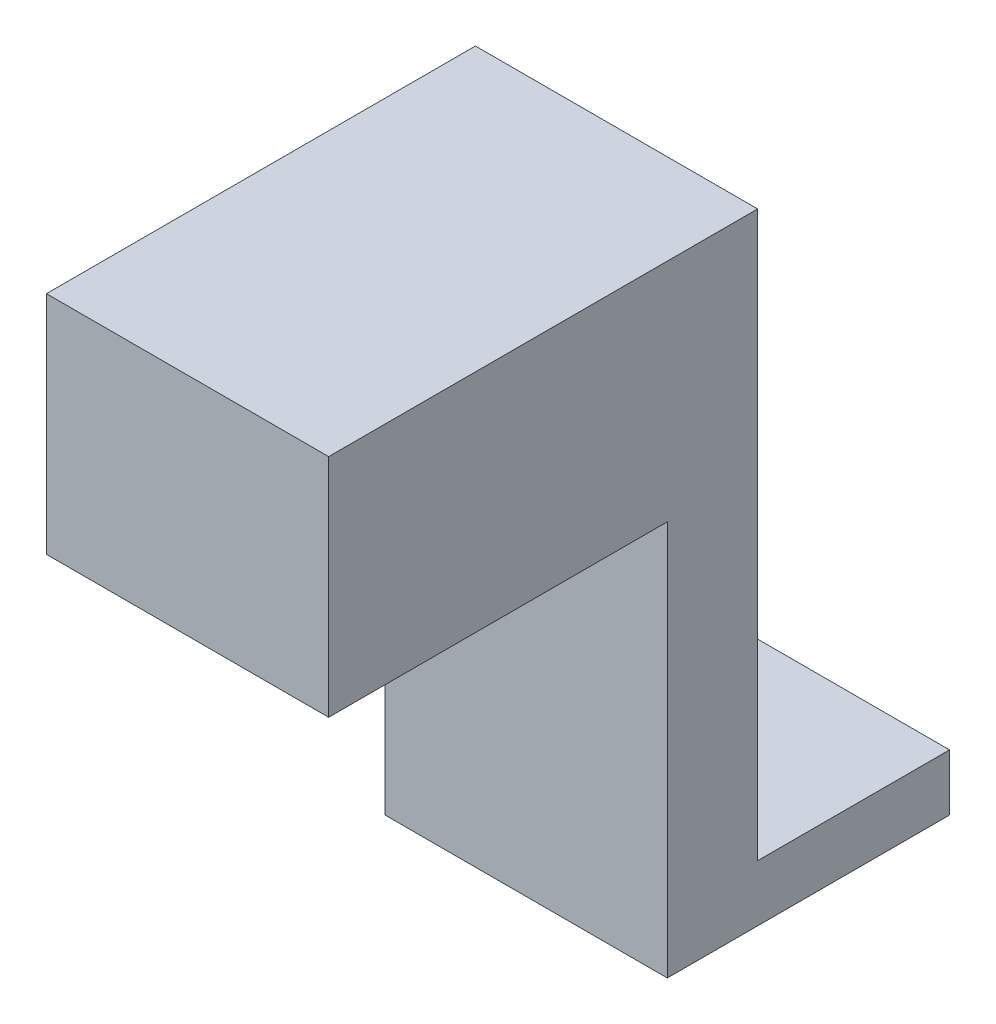
ISO-10303-21;
HEADER;
FILE_DESCRIPTION(('STEP AP214'),'2;1');
FILE_NAME('part.step','',(''),(''),'','','');
FILE_SCHEMA(('AUTOMOTIVE_DESIGN { 1 0 10303 214 1 1 1 1 }'));
ENDSEC;
DATA;
#1=APPLICATION_CONTEXT('core data for automotive mechanical design processes');
#2=APPLICATION_PROTOCOL_DEFINITION('international standard','automotive_design',2000,#1);
#3=PRODUCT_CONTEXT('',#1,'mechanical');
#4=PRODUCT('Part','Part','',(#3));
#5=PRODUCT_RELATED_PRODUCT_CATEGORY('part','',(#4));
#6=PRODUCT_DEFINITION_FORMATION('','',#4);
#7=PRODUCT_DEFINITION_CONTEXT('part definition',#1,'design');
#8=PRODUCT_DEFINITION('design','',#6,#7);
#9=PRODUCT_DEFINITION_SHAPE('','',#8);
#10=(LENGTH_UNIT() NAMED_UNIT(*) SI_UNIT(.MILLI.,.METRE.));
#11=(NAMED_UNIT(*) PLANE_ANGLE_UNIT() SI_UNIT($,.RADIAN.));
#12=(NAMED_UNIT(*) SI_UNIT($,.STERADIAN.) SOLID_ANGLE_UNIT());
#13=UNCERTAINTY_MEASURE_WITH_UNIT(LENGTH_MEASURE(1.E-05),#10,'distance_accuracy_value','');
#14=(GEOMETRIC_REPRESENTATION_CONTEXT(3) GLOBAL_UNCERTAINTY_ASSIGNED_CONTEXT((#13)) GLOBAL_UNIT_ASSIGNED_CONTEXT((#10,
#11,#12)) REPRESENTATION_CONTEXT('',''));
#15=CARTESIAN_POINT('',(0.,0.,0.));
#16=DIRECTION('',(0.,0.,1.));
#17=DIRECTION('',(1.,0.,0.));
#18=AXIS2_PLACEMENT_3D('',#15,#16,#17);
#19=CARTESIAN_POINT('',(12.5,5.,12.5));
#20=DIRECTION('',(0.,0.,-1.));
#21=DIRECTION('',(-1.,0.,0.));
#22=AXIS2_PLACEMENT_3D('',#19,#20,#21);
#23=PLANE('',#22);
#24=DIRECTION('',(1.,0.,0.));
#25=VECTOR('',#24,1.);
#26=CARTESIAN_POINT('',(-12.5,35.,12.5));
#27=LINE('',#26,#25);
#28=CARTESIAN_POINT('',(-12.5,35.,12.5));
#29=VERTEX_POINT('',#28);
#30=CARTESIAN_POINT('',(12.5,35.,12.5));
#31=VERTEX_POINT('',#30);
#32=EDGE_CURVE('E57',#29,#31,#27,.T.);
#33=ORIENTED_EDGE('',*,*,#32,.F.);
#34=DIRECTION('',(0.,-1.,0.));
#35=VECTOR('',#34,1.);
#36=CARTESIAN_POINT('',(-12.5,5.,12.5));
#37=LINE('',#36,#35);
#38=CARTESIAN_POINT('',(-12.5,0.,12.5));
#39=VERTEX_POINT('',#38);
#40=EDGE_CURVE('E11',#29,#39,#37,.T.);
#41=ORIENTED_EDGE('',*,*,#40,.T.);
#42=DIRECTION('',(1.,0.,0.));
#43=VECTOR('',#42,1.);
#44=CARTESIAN_POINT('',(12.5,0.,12.5));
#45=LINE('',#44,#43);
#46=CARTESIAN_POINT('',(12.5,0.,12.5));
#47=VERTEX_POINT('',#46);
#48=EDGE_CURVE('E156',#39,#47,#45,.T.);
#49=ORIENTED_EDGE('',*,*,#48,.T.);
#50=DIRECTION('',(0.,-1.,0.));
#51=VECTOR('',#50,1.);
#52=CARTESIAN_POINT('',(12.5,5.,12.5));
#53=LINE('',#52,#51);
#54=EDGE_CURVE('E51',#31,#47,#53,.T.);
#55=ORIENTED_EDGE('',*,*,#54,.F.);
#56=EDGE_LOOP('',(#33,#41,#49,#55));
#57=FACE_BOUND('',#56,.T.);
#58=ADVANCED_FACE('F43',(#57),#23,.F.);
#59=CARTESIAN_POINT('',(-12.5,5.,12.5));
#60=DIRECTION('',(1.,0.,0.));
#61=DIRECTION('',(0.,0.,-1.));
#62=AXIS2_PLACEMENT_3D('',#59,#60,#61);
#63=PLANE('',#62);
#64=DIRECTION('',(0.,0.,1.));
#65=VECTOR('',#64,1.);
#66=CARTESIAN_POINT('',(-12.5,0.,12.5));
#67=LINE('',#66,#65);
#68=CARTESIAN_POINT('',(-12.5,0.,-12.5));
#69=VERTEX_POINT('',#68);
#70=EDGE_CURVE('E146',#69,#39,#67,.T.);
#71=ORIENTED_EDGE('',*,*,#70,.T.);
#72=ORIENTED_EDGE('',*,*,#40,.F.);
#73=DIRECTION('',(0.,0.,-1.));
#74=VECTOR('',#73,1.);
#75=CARTESIAN_POINT('',(-12.5,35.,42.5));
#76=LINE('',#75,#74);
#77=CARTESIAN_POINT('',(-12.5,35.,42.5));
#78=VERTEX_POINT('',#77);
#79=EDGE_CURVE('E111',#78,#29,#76,.T.);
#80=ORIENTED_EDGE('',*,*,#79,.F.);
#81=DIRECTION('',(0.,-1.,0.));
#82=VECTOR('',#81,1.);
#83=CARTESIAN_POINT('',(-12.5,55.,42.5));
#84=LINE('',#83,#82);
#85=CARTESIAN_POINT('',(-12.5,55.,42.5));
#86=VERTEX_POINT('',#85);
#87=EDGE_CURVE('E118',#86,#78,#84,.T.);
#88=ORIENTED_EDGE('',*,*,#87,.F.);
#89=DIRECTION('',(0.,0.,1.));
#90=VECTOR('',#89,1.);
#91=CARTESIAN_POINT('',(-12.5,55.,12.5));
#92=LINE('',#91,#90);
#93=CARTESIAN_POINT('',(-12.5,55.,4.5));
#94=VERTEX_POINT('',#93);
#95=EDGE_CURVE('E130',#94,#86,#92,.T.);
#96=ORIENTED_EDGE('',*,*,#95,.F.);
#97=DIRECTION('',(0.,-1.,0.));
#98=VECTOR('',#97,1.);
#99=CARTESIAN_POINT('',(-12.5,55.,4.5));
#100=LINE('',#99,#98);
#101=CARTESIAN_POINT('',(-12.5,5.,4.5));
#102=VERTEX_POINT('',#101);
#103=EDGE_CURVE('E139',#94,#102,#100,.T.);
#104=ORIENTED_EDGE('',*,*,#103,.T.);
#105=DIRECTION('',(0.,0.,1.));
#106=VECTOR('',#105,1.);
#107=CARTESIAN_POINT('',(-12.5,5.,12.5));
#108=LINE('',#107,#106);
#109=CARTESIAN_POINT('',(-12.5,5.,-12.5));
#110=VERTEX_POINT('',#109);
#111=EDGE_CURVE('E147',#110,#102,#108,.T.);
#112=ORIENTED_EDGE('',*,*,#111,.F.);
#113=DIRECTION('',(0.,-1.,0.));
#114=VECTOR('',#113,1.);
#115=CARTESIAN_POINT('',(-12.5,5.,-12.5));
#116=LINE('',#115,#114);
#117=EDGE_CURVE('E154',#110,#69,#116,.T.);
#118=ORIENTED_EDGE('',*,*,#117,.T.);
#119=EDGE_LOOP('',(#71,#72,#80,#88,#96,#104,#112,#118));
#120=FACE_BOUND('',#119,.T.);
#121=ADVANCED_FACE('F45',(#120),#63,.F.);
#122=CARTESIAN_POINT('',(12.5,5.,12.5));
#123=DIRECTION('',(-1.,0.,0.));
#124=DIRECTION('',(0.,0.,1.));
#125=AXIS2_PLACEMENT_3D('',#122,#123,#124);
#126=PLANE('',#125);
#127=DIRECTION('',(0.,0.,-1.));
#128=VECTOR('',#127,1.);
#129=CARTESIAN_POINT('',(12.5,0.,12.5));
#130=LINE('',#129,#128);
#131=CARTESIAN_POINT('',(12.5,0.,-12.5));
#132=VERTEX_POINT('',#131);
#133=EDGE_CURVE('E159',#47,#132,#130,.T.);
#134=ORIENTED_EDGE('',*,*,#133,.T.);
#135=DIRECTION('',(0.,-1.,0.));
#136=VECTOR('',#135,1.);
#137=CARTESIAN_POINT('',(12.5,5.,-12.5));
#138=LINE('',#137,#136);
#139=CARTESIAN_POINT('',(12.5,5.,-12.5));
#140=VERTEX_POINT('',#139);
#141=EDGE_CURVE('E164',#140,#132,#138,.T.);
#142=ORIENTED_EDGE('',*,*,#141,.F.);
#143=DIRECTION('',(0.,0.,-1.));
#144=VECTOR('',#143,1.);
#145=CARTESIAN_POINT('',(12.5,5.,12.5));
#146=LINE('',#145,#144);
#147=CARTESIAN_POINT('',(12.5,5.,4.5));
#148=VERTEX_POINT('',#147);
#149=EDGE_CURVE('E149',#148,#140,#146,.T.);
#150=ORIENTED_EDGE('',*,*,#149,.F.);
#151=DIRECTION('',(0.,-1.,0.));
#152=VECTOR('',#151,1.);
#153=CARTESIAN_POINT('',(12.5,55.,4.5));
#154=LINE('',#153,#152);
#155=CARTESIAN_POINT('',(12.5,55.,4.5));
#156=VERTEX_POINT('',#155);
#157=EDGE_CURVE('E143',#156,#148,#154,.T.);
#158=ORIENTED_EDGE('',*,*,#157,.F.);
#159=DIRECTION('',(0.,0.,-1.));
#160=VECTOR('',#159,1.);
#161=CARTESIAN_POINT('',(12.5,55.,12.5));
#162=LINE('',#161,#160);
#163=CARTESIAN_POINT('',(12.5,55.,42.5));
#164=VERTEX_POINT('',#163);
#165=EDGE_CURVE('E136',#164,#156,#162,.T.);
#166=ORIENTED_EDGE('',*,*,#165,.F.);
#167=DIRECTION('',(0.,1.,0.));
#168=VECTOR('',#167,1.);
#169=CARTESIAN_POINT('',(12.5,55.,42.5));
#170=LINE('',#169,#168);
#171=CARTESIAN_POINT('',(12.5,35.,42.5));
#172=VERTEX_POINT('',#171);
#173=EDGE_CURVE('E117',#172,#164,#170,.T.);
#174=ORIENTED_EDGE('',*,*,#173,.F.);
#175=DIRECTION('',(0.,0.,-1.));
#176=VECTOR('',#175,1.);
#177=CARTESIAN_POINT('',(12.5,35.,42.5));
#178=LINE('',#177,#176);
#179=EDGE_CURVE('E113',#172,#31,#178,.T.);
#180=ORIENTED_EDGE('',*,*,#179,.T.);
#181=ORIENTED_EDGE('',*,*,#54,.T.);
#182=EDGE_LOOP('',(#134,#142,#150,#158,#166,#174,#180,#181));
#183=FACE_BOUND('',#182,.T.);
#184=ADVANCED_FACE('F167',(#183),#126,.F.);
#185=CARTESIAN_POINT('',(12.5,5.,-12.5));
#186=DIRECTION('',(0.,0.,1.));
#187=DIRECTION('',(1.,0.,0.));
#188=AXIS2_PLACEMENT_3D('',#185,#186,#187);
#189=PLANE('',#188);
#190=DIRECTION('',(-1.,0.,0.));
#191=VECTOR('',#190,1.);
#192=CARTESIAN_POINT('',(12.5,0.,-12.5));
#193=LINE('',#192,#191);
#194=EDGE_CURVE('E150',#132,#69,#193,.T.);
#195=ORIENTED_EDGE('',*,*,#194,.T.);
#196=ORIENTED_EDGE('',*,*,#117,.F.);
#197=DIRECTION('',(-1.,0.,0.));
#198=VECTOR('',#197,1.);
#199=CARTESIAN_POINT('',(12.5,5.,-12.5));
#200=LINE('',#199,#198);
#201=EDGE_CURVE('E152',#140,#110,#200,.T.);
#202=ORIENTED_EDGE('',*,*,#201,.F.);
#203=ORIENTED_EDGE('',*,*,#141,.T.);
#204=EDGE_LOOP('',(#195,#196,#202,#203));
#205=FACE_BOUND('',#204,.T.);
#206=ADVANCED_FACE('F177',(#205),#189,.F.);
#207=CARTESIAN_POINT('',(0.,5.,0.));
#208=DIRECTION('',(0.,1.,0.));
#209=DIRECTION('',(0.,0.,1.));
#210=AXIS2_PLACEMENT_3D('',#207,#208,#209);
#211=PLANE('',#210);
#212=DIRECTION('',(-1.,0.,0.));
#213=VECTOR('',#212,1.);
#214=CARTESIAN_POINT('',(-12.5,5.,4.5));
#215=LINE('',#214,#213);
#216=EDGE_CURVE('E65',#148,#102,#215,.T.);
#217=ORIENTED_EDGE('',*,*,#216,.F.);
#218=ORIENTED_EDGE('',*,*,#149,.T.);
#219=ORIENTED_EDGE('',*,*,#201,.T.);
#220=ORIENTED_EDGE('',*,*,#111,.T.);
#221=EDGE_LOOP('',(#217,#218,#219,#220));
#222=FACE_BOUND('',#221,.T.);
#223=ADVANCED_FACE('F181',(#222),#211,.T.);
#224=CARTESIAN_POINT('',(0.,0.,0.));
#225=DIRECTION('',(0.,1.,0.));
#226=DIRECTION('',(0.,0.,1.));
#227=AXIS2_PLACEMENT_3D('',#224,#225,#226);
#228=PLANE('',#227);
#229=ORIENTED_EDGE('',*,*,#70,.F.);
#230=ORIENTED_EDGE('',*,*,#194,.F.);
#231=ORIENTED_EDGE('',*,*,#133,.F.);
#232=ORIENTED_EDGE('',*,*,#48,.F.);
#233=EDGE_LOOP('',(#229,#230,#231,#232));
#234=FACE_BOUND('',#233,.T.);
#235=ADVANCED_FACE('F174',(#234),#228,.F.);
#236=CARTESIAN_POINT('',(-12.5,55.,4.5));
#237=DIRECTION('',(0.,0.,1.));
#238=DIRECTION('',(1.,0.,0.));
#239=AXIS2_PLACEMENT_3D('',#236,#237,#238);
#240=PLANE('',#239);
#241=ORIENTED_EDGE('',*,*,#216,.T.);
#242=ORIENTED_EDGE('',*,*,#103,.F.);
#243=DIRECTION('',(-1.,0.,0.));
#244=VECTOR('',#243,1.);
#245=CARTESIAN_POINT('',(-12.5,55.,4.5));
#246=LINE('',#245,#244);
#247=EDGE_CURVE('E138',#156,#94,#246,.T.);
#248=ORIENTED_EDGE('',*,*,#247,.F.);
#249=ORIENTED_EDGE('',*,*,#157,.T.);
#250=EDGE_LOOP('',(#241,#242,#248,#249));
#251=FACE_BOUND('',#250,.T.);
#252=ADVANCED_FACE('F183',(#251),#240,.F.);
#253=CARTESIAN_POINT('',(0.,55.,0.));
#254=DIRECTION('',(0.,-1.,0.));
#255=DIRECTION('',(0.,0.,-1.));
#256=AXIS2_PLACEMENT_3D('',#253,#254,#255);
#257=PLANE('',#256);
#258=ORIENTED_EDGE('',*,*,#95,.T.);
#259=DIRECTION('',(-1.,0.,0.));
#260=VECTOR('',#259,1.);
#261=CARTESIAN_POINT('',(-12.5,55.,42.5));
#262=LINE('',#261,#260);
#263=EDGE_CURVE('E124',#164,#86,#262,.T.);
#264=ORIENTED_EDGE('',*,*,#263,.F.);
#265=ORIENTED_EDGE('',*,*,#165,.T.);
#266=ORIENTED_EDGE('',*,*,#247,.T.);
#267=EDGE_LOOP('',(#258,#264,#265,#266));
#268=FACE_BOUND('',#267,.T.);
#269=ADVANCED_FACE('F188',(#268),#257,.F.);
#270=CARTESIAN_POINT('',(-12.5,35.,42.5));
#271=DIRECTION('',(0.,1.,0.));
#272=DIRECTION('',(0.,0.,1.));
#273=AXIS2_PLACEMENT_3D('',#270,#271,#272);
#274=PLANE('',#273);
#275=ORIENTED_EDGE('',*,*,#32,.T.);
#276=ORIENTED_EDGE('',*,*,#179,.F.);
#277=DIRECTION('',(1.,0.,0.));
#278=VECTOR('',#277,1.);
#279=CARTESIAN_POINT('',(-12.5,35.,42.5));
#280=LINE('',#279,#278);
#281=EDGE_CURVE('E107',#78,#172,#280,.T.);
#282=ORIENTED_EDGE('',*,*,#281,.F.);
#283=ORIENTED_EDGE('',*,*,#79,.T.);
#284=EDGE_LOOP('',(#275,#276,#282,#283));
#285=FACE_BOUND('',#284,.T.);
#286=ADVANCED_FACE('F109',(#285),#274,.F.);
#287=CARTESIAN_POINT('',(0.,0.,42.5));
#288=DIRECTION('',(0.,0.,1.));
#289=DIRECTION('',(1.,0.,0.));
#290=AXIS2_PLACEMENT_3D('',#287,#288,#289);
#291=PLANE('',#290);
#292=ORIENTED_EDGE('',*,*,#87,.T.);
#293=ORIENTED_EDGE('',*,*,#281,.T.);
#294=ORIENTED_EDGE('',*,*,#173,.T.);
#295=ORIENTED_EDGE('',*,*,#263,.T.);
#296=EDGE_LOOP('',(#292,#293,#294,#295));
#297=FACE_BOUND('',#296,.T.);
#298=ADVANCED_FACE('F122',(#297),#291,.T.);
#299=CLOSED_SHELL('',(#58,#121,#184,#206,#223,#235,#252,#269,#286,#298));
#300=MANIFOLD_SOLID_BREP('B2',#299);
#301=ADVANCED_BREP_SHAPE_REPRESENTATION('',(#18,#300),#14);
#302=SHAPE_DEFINITION_REPRESENTATION(#9,#301);
ENDSEC;
END-ISO-10303-21;
